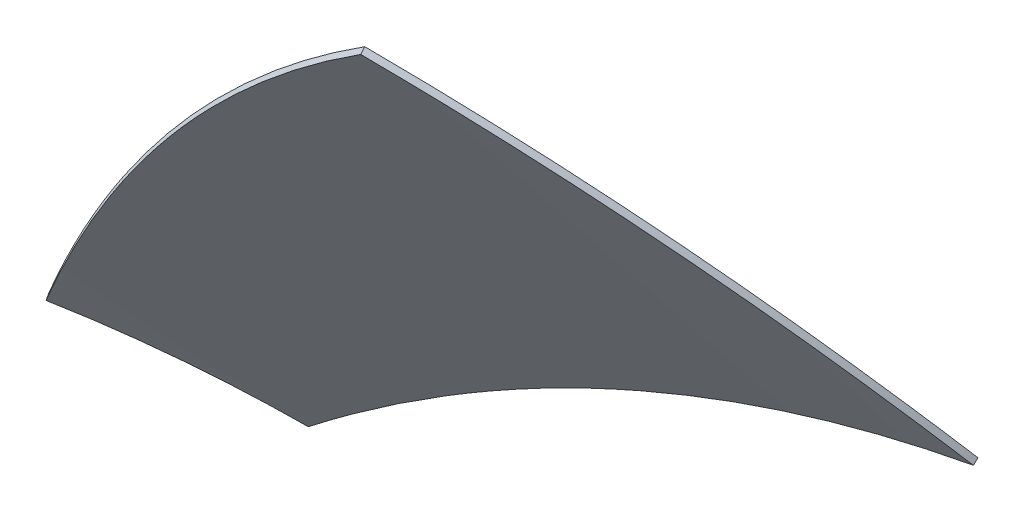
ISO-10303-21;
HEADER;
FILE_DESCRIPTION(('STEP AP214'),'2;1');
FILE_NAME('part.step','',(''),(''),'','','');
FILE_SCHEMA(('AUTOMOTIVE_DESIGN { 1 0 10303 214 1 1 1 1 }'));
ENDSEC;
DATA;
#1=APPLICATION_CONTEXT('core data for automotive mechanical design processes');
#2=APPLICATION_PROTOCOL_DEFINITION('international standard','automotive_design',2000,#1);
#3=PRODUCT_CONTEXT('',#1,'mechanical');
#4=PRODUCT('Part','Part','',(#3));
#5=PRODUCT_RELATED_PRODUCT_CATEGORY('part','',(#4));
#6=PRODUCT_DEFINITION_FORMATION('','',#4);
#7=PRODUCT_DEFINITION_CONTEXT('part definition',#1,'design');
#8=PRODUCT_DEFINITION('design','',#6,#7);
#9=PRODUCT_DEFINITION_SHAPE('','',#8);
#10=(LENGTH_UNIT() NAMED_UNIT(*) SI_UNIT(.MILLI.,.METRE.));
#11=(NAMED_UNIT(*) PLANE_ANGLE_UNIT() SI_UNIT($,.RADIAN.));
#12=(NAMED_UNIT(*) SI_UNIT($,.STERADIAN.) SOLID_ANGLE_UNIT());
#13=UNCERTAINTY_MEASURE_WITH_UNIT(LENGTH_MEASURE(1.E-05),#10,'distance_accuracy_value','');
#14=(GEOMETRIC_REPRESENTATION_CONTEXT(3) GLOBAL_UNCERTAINTY_ASSIGNED_CONTEXT((#13)) GLOBAL_UNIT_ASSIGNED_CONTEXT((#10,
#11,#12)) REPRESENTATION_CONTEXT('',''));
#15=CARTESIAN_POINT('',(0.,0.,0.));
#16=DIRECTION('',(0.,0.,1.));
#17=DIRECTION('',(1.,0.,0.));
#18=AXIS2_PLACEMENT_3D('',#15,#16,#17);
#19=CARTESIAN_POINT('',(164.677765247662,-161.806983646193,-2.70380006520967));
#20=DIRECTION('',(0.,0.,1.));
#21=DIRECTION('',(1.,0.,0.));
#22=AXIS2_PLACEMENT_3D('',#19,#20,#21);
#23=CONICAL_SURFACE('',#22,60.5897364806194,0.959931088596881);
#24=CARTESIAN_POINT('',(145.713494932421,-104.341377596432,-2.75685890943702));
#25=CARTESIAN_POINT('',(145.607225304668,-104.419446481523,-2.78545031196069));
#26=CARTESIAN_POINT('',(145.501244422635,-104.497895044637,-2.8140846506439));
#27=CARTESIAN_POINT('',(144.972755874823,-104.892052040336,-2.95747719661464));
#28=CARTESIAN_POINT('',(144.554615530205,-105.213415494873,-3.07286583752212));
#29=CARTESIAN_POINT('',(143.727953120132,-105.867853595363,-3.30487066357202));
#30=CARTESIAN_POINT('',(143.31943104411,-106.20092822845,-3.42148684736563));
#31=CARTESIAN_POINT('',(142.714110182886,-106.709063155329,-3.59725752114053));
#32=CARTESIAN_POINT('',(142.51358758485,-106.879855454828,-3.65598661374874));
#33=CARTESIAN_POINT('',(141.915746184766,-107.396489727506,-3.8326012584793));
#34=CARTESIAN_POINT('',(141.52218385294,-107.746564552002,-3.95090559239463));
#35=CARTESIAN_POINT('',(140.939655452774,-108.279865787299,-4.12913543100646));
#36=CARTESIAN_POINT('',(140.746788794091,-108.458990951779,-4.18867206015954));
#37=CARTESIAN_POINT('',(140.172093821618,-109.000468226771,-4.36768046820569));
#38=CARTESIAN_POINT('',(139.794199623641,-109.366896224075,-4.48754201820771));
#39=CARTESIAN_POINT('',(139.235543374011,-109.924419359587,-4.66806686045669));
#40=CARTESIAN_POINT('',(139.05069546444,-110.111566881271,-4.72836165708129));
#41=CARTESIAN_POINT('',(138.500261015965,-110.676964014639,-4.90963440814225));
#42=CARTESIAN_POINT('',(138.138812025549,-111.059140788549,-5.03099176164526));
#43=CARTESIAN_POINT('',(137.427229102912,-111.833589290189,-5.27461244724082));
#44=CARTESIAN_POINT('',(137.077095157683,-112.225861006312,-5.39687577829156));
#45=CARTESIAN_POINT('',(136.388321177041,-113.020133390027,-5.64217967862846));
#46=CARTESIAN_POINT('',(136.049681128926,-113.422134046867,-5.76522024705555));
#47=CARTESIAN_POINT('',(135.384112636649,-114.235512897457,-6.01197339601547));
#48=CARTESIAN_POINT('',(135.057184184198,-114.646891084568,-6.13568597607261));
#49=CARTESIAN_POINT('',(134.415262489176,-115.478684941217,-6.38369025592495));
#50=CARTESIAN_POINT('',(134.100269242735,-115.899100607824,-6.50798195553236));
#51=CARTESIAN_POINT('',(133.482457724483,-116.748640172092,-6.7570677368484));
#52=CARTESIAN_POINT('',(133.179639453266,-117.177764070179,-6.88186181858158));
#53=CARTESIAN_POINT('',(132.586434476111,-118.044390766266,-7.1318864310882));
#54=CARTESIAN_POINT('',(132.296047775331,-118.481893567741,-7.25711696204267));
#55=CARTESIAN_POINT('',(131.548937939594,-119.643291396346,-7.58703758072571));
#56=CARTESIAN_POINT('',(131.102742654481,-120.373881957302,-7.79205754909997));
#57=CARTESIAN_POINT('',(130.674005773103,-121.114552276329,-7.99752302693661));
#58=B_SPLINE_CURVE_WITH_KNOTS('',3,(#24,#25,#26,#27,#28,#29,#30,#31,#32,#33,#34,#35,#36,#37,#38,
#39,#40,#41,#42,#43,#44,#45,#46,#47,#48,#49,#50,#51,#52,#53,#54,#55,#56,#57),.UNSPECIFIED.,.F.,
.F.,(4,2,2,2,2,2,2,2,2,2,2,2,2,2,2,2,4),(0.,0.404785746297728,2.02408047516249,3.64337342494574,
4.45295972721342,6.07225152820658,6.88183780485193,8.50113011852531,9.3107165672272,
10.9300105621245,12.5493026952509,14.1685930389361,15.7878822365273,17.4071709090637,
19.0264596606987,20.6457490840248,23.2857206570532),.UNSPECIFIED.);
#59=CARTESIAN_POINT('',(145.713494932421,-104.341377596432,-2.75685890943712));
#60=VERTEX_POINT('',#59);
#61=CARTESIAN_POINT('',(130.674005773102,-121.114552276329,-7.99752302693631));
#62=VERTEX_POINT('',#61);
#63=EDGE_CURVE('E24',#60,#62,#58,.T.);
#64=ORIENTED_EDGE('',*,*,#63,.T.);
#65=CARTESIAN_POINT('',(130.674005773103,-121.114552276329,-7.99752302693621));
#66=CARTESIAN_POINT('',(130.780010183614,-121.157870975191,-8.06839270908241));
#67=CARTESIAN_POINT('',(130.885360123607,-121.2023684865,-8.13954595753031));
#68=CARTESIAN_POINT('',(131.409063245566,-121.430747440456,-8.49686090490643));
#69=CARTESIAN_POINT('',(131.817336354725,-121.63192702956,-8.78704423252544));
#70=CARTESIAN_POINT('',(132.446402386398,-121.977620110933,-9.25266430868875));
#71=CARTESIAN_POINT('',(132.674939038419,-122.111187448792,-9.42595602925599));
#72=CARTESIAN_POINT('',(132.994798262464,-122.309460646346,-9.67445744911161));
#73=CARTESIAN_POINT('',(133.08955990236,-122.369669244377,-9.74885104371575));
#74=CARTESIAN_POINT('',(133.507478776553,-122.641736032716,-10.080402685016));
#75=CARTESIAN_POINT('',(133.82231820474,-122.864292471453,-10.3394946224091));
#76=CARTESIAN_POINT('',(134.215785846258,-123.165510374972,-10.6757424971135));
#77=CARTESIAN_POINT('',(134.30345206687,-123.234178082967,-10.7514987942411));
#78=CARTESIAN_POINT('',(134.683428646579,-123.53868893267,-11.0835807574494));
#79=CARTESIAN_POINT('',(134.966973776721,-123.784017605835,-11.3411894895936));
#80=CARTESIAN_POINT('',(135.240458471532,-124.039479469806,-11.5999996128498));
#81=B_SPLINE_CURVE_WITH_KNOTS('',3,(#65,#66,#67,#68,#69,#70,#71,#72,#73,#74,#75,#76,#77,#78,#79,
#80),.UNSPECIFIED.,.F.,.F.,(4,2,2,2,2,2,2,4),(0.,0.404039967202498,2.02138933713873,
2.97026784667526,3.37430460638565,4.76665393129996,5.1706901907467,6.53488990231765),.UNSPECIFIED.);
#82=CARTESIAN_POINT('',(135.24045847322,-124.039479471383,-11.5999996144474));
#83=VERTEX_POINT('',#82);
#84=EDGE_CURVE('E119',#62,#83,#81,.T.);
#85=ORIENTED_EDGE('',*,*,#84,.T.);
#86=CARTESIAN_POINT('',(135.24045847435,-124.039479473395,-11.5999996160448));
#87=CARTESIAN_POINT('',(135.347951970338,-123.955695174218,-11.5999996494659));
#88=CARTESIAN_POINT('',(135.455809618855,-123.872374182624,-11.6000047399862));
#89=CARTESIAN_POINT('',(135.996954251853,-123.458053693674,-11.6000530761268));
#90=CARTESIAN_POINT('',(136.435631000727,-123.134048270053,-11.6001649766075));
#91=CARTESIAN_POINT('',(137.323849057909,-122.501320053386,-11.6004735845139));
#92=CARTESIAN_POINT('',(137.773390351892,-122.19259724019,-11.6006702918279));
#93=CARTESIAN_POINT('',(138.682783088813,-121.590722474117,-11.6010958966164));
#94=CARTESIAN_POINT('',(139.142634520299,-121.297570503943,-11.6013247940552));
#95=CARTESIAN_POINT('',(140.072068462629,-120.727133342786,-11.6017712994769));
#96=CARTESIAN_POINT('',(140.54165096477,-120.449848137612,-11.6019889074699));
#97=CARTESIAN_POINT('',(141.489994589073,-119.911416324192,-11.6023789968145));
#98=CARTESIAN_POINT('',(141.968755705072,-119.650269705108,-11.6025514781963));
#99=CARTESIAN_POINT('',(142.693282644822,-119.270894579536,-11.6027589088298));
#100=CARTESIAN_POINT('',(142.935842483944,-119.146500094628,-11.602819501902));
#101=CARTESIAN_POINT('',(143.666708732576,-118.779486132016,-11.6029726866694));
#102=CARTESIAN_POINT('',(144.15815012175,-118.543064373516,-11.6030366646345));
#103=CARTESIAN_POINT('',(145.148756515376,-118.087042209601,-11.6030799623007));
#104=CARTESIAN_POINT('',(145.647921519069,-117.867441802531,-11.6030592820101));
#105=CARTESIAN_POINT('',(146.65343487504,-117.445303998216,-11.6029358242943));
#106=CARTESIAN_POINT('',(147.159783228276,-117.242766603247,-11.6028330468581));
#107=CARTESIAN_POINT('',(147.924181712739,-116.951975311196,-11.6026274061319));
#108=CARTESIAN_POINT('',(148.179779921985,-116.857218783119,-11.6025502856862));
#109=CARTESIAN_POINT('',(148.949010973358,-116.579461891372,-11.6022970817963));
#110=CARTESIAN_POINT('',(149.465025184736,-116.402996242566,-11.6020991678217));
#111=CARTESIAN_POINT('',(150.502751598229,-116.06775734335,-11.6016733387467));
#112=CARTESIAN_POINT('',(151.024463804364,-115.908984105426,-11.6014454236252));
#113=CARTESIAN_POINT('',(152.07302693343,-115.609357256864,-11.6009981951362));
#114=CARTESIAN_POINT('',(152.599877861127,-115.468503662852,-11.6007788817767));
#115=CARTESIAN_POINT('',(153.39348237769,-115.27085486069,-11.6004924206027));
#116=CARTESIAN_POINT('',(153.658557284031,-115.207246970985,-11.600404022036));
#117=CARTESIAN_POINT('',(154.596221500762,-114.990749045836,-11.6001296377105));
#118=CARTESIAN_POINT('',(155.271665503102,-114.850190578458,-11.6000013307996));
#119=CARTESIAN_POINT('',(155.949990445605,-114.72444602859,-11.5999996160448));
#120=B_SPLINE_CURVE_WITH_KNOTS('',3,(#86,#87,#88,#89,#90,#91,#92,#93,#94,#95,#96,#97,#98,#99,
#100,#101,#102,#103,#104,#105,#106,#107,#108,#109,#110,#111,#112,#113,#114,#115,#116,#117,#118,
#119),.UNSPECIFIED.,.F.,.F.,(4,2,2,2,2,2,2,2,2,2,2,2,2,2,2,2,4),(0.,0.408872021062319,
2.04458807223249,3.68030196669168,5.31601404417217,6.95172465868246,8.58743417477637,
9.40520007880727,11.0409086462069,12.6766170528684,14.3123256776974,15.1300916080284,
16.7658012669123,18.4015120800397,20.0372244105804,20.8549909367445,22.9242005441218),.UNSPECIFIED.);
#121=CARTESIAN_POINT('',(155.949990457788,-114.724446015506,-11.5999996085914));
#122=VERTEX_POINT('',#121);
#123=EDGE_CURVE('E69',#83,#122,#120,.T.);
#124=ORIENTED_EDGE('',*,*,#123,.T.);
#125=CARTESIAN_POINT('',(155.949990469971,-114.724446002421,-11.5999996011381));
#126=CARTESIAN_POINT('',(155.887990162428,-114.629803978791,-11.5269277910737));
#127=CARTESIAN_POINT('',(155.825545250114,-114.535400439451,-11.4539216141485));
#128=CARTESIAN_POINT('',(155.636850501834,-114.252915275906,-11.2350973072199));
#129=CARTESIAN_POINT('',(155.509250206676,-114.065573981897,-11.0894848477296));
#130=CARTESIAN_POINT('',(155.315074537723,-113.786128616506,-10.8715023186324));
#131=CARTESIAN_POINT('',(155.249882159292,-113.693234868922,-10.7989091493191));
#132=CARTESIAN_POINT('',(155.118568102341,-113.507984379142,-10.6538734847002));
#133=CARTESIAN_POINT('',(155.05244640659,-113.415627646949,-10.581430992217));
#134=CARTESIAN_POINT('',(154.852330554802,-113.138949930964,-10.363990384886));
#135=CARTESIAN_POINT('',(154.716900688701,-112.955475306612,-10.2192331020793));
#136=CARTESIAN_POINT('',(154.442390768827,-112.590771940971,-9.93034264762662));
#137=CARTESIAN_POINT('',(154.303310603305,-112.409543268688,-9.78620949524514));
#138=CARTESIAN_POINT('',(154.021855067595,-112.049189587161,-9.49848854379869));
#139=CARTESIAN_POINT('',(153.879479418234,-111.870064758092,-9.35490079214506));
#140=CARTESIAN_POINT('',(153.591235115598,-111.514135004343,-9.06835790941786));
#141=CARTESIAN_POINT('',(153.44536648462,-111.337330064866,-8.92540277431321));
#142=CARTESIAN_POINT('',(153.15001606895,-110.986203591204,-8.6401833685079));
#143=CARTESIAN_POINT('',(153.000534354696,-110.811882008712,-8.49791908440389));
#144=CARTESIAN_POINT('',(152.697917108614,-110.465839457632,-8.21411813857969));
#145=CARTESIAN_POINT('',(152.54478154673,-110.294118510458,-8.07258148285695));
#146=CARTESIAN_POINT('',(152.080027214191,-109.782971576924,-7.64910567342873));
#147=CARTESIAN_POINT('',(151.763017291441,-109.447509764941,-7.36825867805563));
#148=CARTESIAN_POINT('',(151.277722235689,-108.952879214092,-6.94955050669778));
#149=CARTESIAN_POINT('',(151.114529627578,-108.789620915469,-6.81057404082087));
#150=CARTESIAN_POINT('',(150.78484273402,-108.465869602596,-6.53337507257238));
#151=CARTESIAN_POINT('',(150.618348828011,-108.305376274469,-6.39515248585514));
#152=CARTESIAN_POINT('',(150.113964304522,-107.828075414162,-5.98159218949962));
#153=CARTESIAN_POINT('',(149.771178419024,-107.5154546872,-5.70736844271489));
#154=CARTESIAN_POINT('',(149.072921569564,-106.901885292023,-5.16201748177781));
#155=CARTESIAN_POINT('',(148.717450576427,-106.600936650657,-4.89089027474917));
#156=CARTESIAN_POINT('',(148.174940808852,-106.158766035365,-4.48668164262353));
#157=CARTESIAN_POINT('',(147.992562940675,-106.012924885354,-4.35236572223026));
#158=CARTESIAN_POINT('',(147.470067483613,-105.603105109157,-3.97199688775233));
#159=CARTESIAN_POINT('',(147.126247178738,-105.342892808342,-3.72694466704815));
#160=CARTESIAN_POINT('',(146.427846477052,-104.833565478698,-3.2396629766787));
#161=CARTESIAN_POINT('',(146.073255714196,-104.584461749436,-2.99743655830583));
#162=CARTESIAN_POINT('',(145.713494932421,-104.341377596433,-2.75685890943715));
#163=B_SPLINE_CURVE_WITH_KNOTS('',3,(#125,#126,#127,#128,#129,#130,#131,#132,#133,#134,#135,
#136,#137,#138,#139,#140,#141,#142,#143,#144,#145,#146,#147,#148,#149,#150,#151,#152,#153,#154,
#155,#156,#157,#158,#159,#160,#161,#162),.UNSPECIFIED.,.F.,.F.,(4,2,2,2,2,2,2,2,2,2,2,2,2,2,2,2,
2,2,4),(0.,0.40406407420745,1.21225539803086,1.6164071244678,2.02056635469793,2.83085306958814,
3.64116461902188,4.45154506620358,5.26192034214463,6.07227983251894,6.88264599159149,
8.50313968458857,9.31144155114741,10.1196510475197,11.7361077374934,13.3525681454349,
14.1607182651822,15.6483272818095,17.1374164906629),.UNSPECIFIED.);
#164=EDGE_CURVE('E66',#122,#60,#163,.T.);
#165=ORIENTED_EDGE('',*,*,#164,.T.);
#166=EDGE_LOOP('',(#64,#85,#124,#165));
#167=FACE_BOUND('',#166,.T.);
#168=ADVANCED_FACE('F17',(#167),#23,.F.);
#169=CARTESIAN_POINT('',(130.59971208158,-121.025644726392,-8.16299173988277));
#170=CARTESIAN_POINT('',(130.599957275281,-121.02593815065,-8.16244563851991));
#171=CARTESIAN_POINT('',(130.600202468983,-121.026231574907,-8.16189953715705));
#172=CARTESIAN_POINT('',(130.600447662684,-121.026524999164,-8.16135343579419));
#173=CARTESIAN_POINT('',(130.624967032824,-121.055867424886,-8.10674329950826));
#174=CARTESIAN_POINT('',(130.649486402963,-121.085209850608,-8.05213316322233));
#175=CARTESIAN_POINT('',(130.674005773103,-121.114552276329,-7.99752302693641));
#176=CARTESIAN_POINT('',(132.766184593014,-117.288830760427,-7.12789737510282));
#177=CARTESIAN_POINT('',(132.766407367252,-117.289142924679,-7.12735127373996));
#178=CARTESIAN_POINT('',(132.766630141491,-117.289455088931,-7.1268051723771));
#179=CARTESIAN_POINT('',(132.76685291573,-117.289767253183,-7.12625907101424));
#180=CARTESIAN_POINT('',(132.789130339606,-117.320983678376,-7.07164893472832));
#181=CARTESIAN_POINT('',(132.811411171902,-117.352195560236,-7.01703879844239));
#182=CARTESIAN_POINT('',(132.833688595779,-117.38341198543,-6.96242866215647));
#183=CARTESIAN_POINT('',(137.372285046869,-111.141326369228,-5.31571778038501));
#184=CARTESIAN_POINT('',(137.372466129202,-111.141665700915,-5.31517167902215));
#185=CARTESIAN_POINT('',(137.372647211535,-111.142005032601,-5.31462557765929));
#186=CARTESIAN_POINT('',(137.372828293868,-111.142344364288,-5.31407947629643));
#187=CARTESIAN_POINT('',(137.390936527182,-111.176277532943,-5.2594693400105));
#188=CARTESIAN_POINT('',(137.40904318463,-111.2102124,-5.20485920372458));
#189=CARTESIAN_POINT('',(137.427151417944,-111.244145568655,-5.15024906743865));
#190=CARTESIAN_POINT('',(143.092460012499,-106.127927310826,-3.61624611019745));
#191=CARTESIAN_POINT('',(143.092598104836,-106.128284408425,-3.61570000883459));
#192=CARTESIAN_POINT('',(143.092736197174,-106.128641506025,-3.61515390747173));
#193=CARTESIAN_POINT('',(143.092874289511,-106.128998603624,-3.61460780610887));
#194=CARTESIAN_POINT('',(143.106683523238,-106.164708363554,-3.55999766982294));
#195=CARTESIAN_POINT('',(143.120493377965,-106.200417592462,-3.50538753353702));
#196=CARTESIAN_POINT('',(143.134302611692,-106.236127352392,-3.4507773972511));
#197=CARTESIAN_POINT('',(145.677185184843,-104.23135165737,-2.92232762238331));
#198=CARTESIAN_POINT('',(145.677305018993,-104.231714779281,-2.92178152102045));
#199=CARTESIAN_POINT('',(145.677424853144,-104.232077901192,-2.92123541965759));
#200=CARTESIAN_POINT('',(145.677544687294,-104.232441023103,-2.92068931829473));
#201=CARTESIAN_POINT('',(145.689528102336,-104.268753214212,-2.86607918200881));
#202=CARTESIAN_POINT('',(145.701511517379,-104.305065405322,-2.81146904572289));
#203=CARTESIAN_POINT('',(145.713494932421,-104.341377596432,-2.75685890943696));
#204=B_SPLINE_SURFACE_WITH_KNOTS('',3,3,((#169,#170,#171,#172,#173,#174,#175),(#176,#177,#178,
#179,#180,#181,#182),(#183,#184,#185,#186,#187,#188,#189),(#190,#191,#192,#193,#194,#195,#196),
(#197,#198,#199,#200,#201,#202,#203)),.UNSPECIFIED.,.F.,.F.,.F.,(4,1,4),(4,3,4),(0.,
0.571428571428571,1.),(-0.01,0.,1.),.UNSPECIFIED.);
#205=DIRECTION('',(0.367790552085545,-0.440136385830606,0.819152044290059));
#206=VECTOR('',#205,1.);
#207=CARTESIAN_POINT('',(130.637594508445,-121.070978774133,-8.078619079321));
#208=LINE('',#207,#206);
#209=CARTESIAN_POINT('',(130.602153990644,-121.028566038,-8.15755361789338));
#210=VERTEX_POINT('',#209);
#211=EDGE_CURVE('E78',#210,#62,#208,.T.);
#212=DIRECTION('',(-0.179751225644478,0.54468286664893,-0.819152044286292));
#213=VECTOR('',#212,1.);
#214=CARTESIAN_POINT('',(145.695519809858,-104.286909309768,-2.83877411386609));
#215=LINE('',#214,#213);
#216=CARTESIAN_POINT('',(145.677544679896,-104.232441018115,-2.920689313355));
#217=VERTEX_POINT('',#216);
#218=EDGE_CURVE('E73',#60,#217,#215,.T.);
#219=CARTESIAN_POINT('',(130.602154309022,-121.028565488528,-8.15755346593886));
#220=CARTESIAN_POINT('',(130.667291071637,-120.916149257558,-8.12646529209306));
#221=CARTESIAN_POINT('',(130.732831785229,-120.803962632582,-8.09538661822159));
#222=CARTESIAN_POINT('',(131.062566618538,-120.244150955685,-7.94003108596973));
#223=CARTESIAN_POINT('',(131.332784406926,-119.800011942344,-7.81590135323699));
#224=CARTESIAN_POINT('',(131.885756329915,-118.919523493207,-7.5679951217375));
#225=CARTESIAN_POINT('',(132.168510451887,-118.483174049566,-7.44421862261509));
#226=CARTESIAN_POINT('',(132.746295014612,-117.618557577306,-7.19705590746242));
#227=CARTESIAN_POINT('',(133.041325447224,-117.190290543327,-7.07366969117341));
#228=CARTESIAN_POINT('',(133.643390138888,-116.342175210068,-6.82735111494786));
#229=CARTESIAN_POINT('',(133.950424394131,-115.922326908115,-6.70441875486726));
#230=CARTESIAN_POINT('',(134.889443859982,-114.67552764199,-6.33629581070549));
#231=CARTESIAN_POINT('',(135.539181807598,-113.861567635682,-6.09184945921674));
#232=CARTESIAN_POINT('',(136.54758258947,-112.669073024062,-5.72735853166878));
#233=CARTESIAN_POINT('',(136.889297886726,-112.276369133034,-5.60624159440968));
#234=CARTESIAN_POINT('',(137.583891041514,-111.500660603854,-5.36480955245761));
#235=CARTESIAN_POINT('',(137.936768911781,-111.11765597677,-5.24449444867961));
#236=CARTESIAN_POINT('',(138.474267265353,-110.550754204577,-5.06473791114257));
#237=CARTESIAN_POINT('',(138.654790318543,-110.363061105244,-5.00494056133917));
#238=CARTESIAN_POINT('',(139.200447307387,-109.803775197502,-4.82589292425726));
#239=CARTESIAN_POINT('',(139.569643482998,-109.436003551456,-4.70699577194184));
#240=CARTESIAN_POINT('',(140.131233195018,-108.892252843443,-4.52939529239466));
#241=CARTESIAN_POINT('',(140.319722004103,-108.712326806532,-4.47032147747802));
#242=CARTESIAN_POINT('',(141.268924055796,-107.819023212408,-4.17546826775381));
#243=CARTESIAN_POINT('',(142.049105476678,-107.125413079379,-3.94149282109032));
#244=CARTESIAN_POINT('',(143.307584203198,-106.06887660321,-3.57668695429995));
#245=CARTESIAN_POINT('',(143.772962361959,-105.690907783258,-3.4443611306423));
#246=CARTESIAN_POINT('',(144.716069628765,-104.950176491461,-3.18130275981973));
#247=CARTESIAN_POINT('',(145.193798178683,-104.587413334393,-3.05057014104767));
#248=CARTESIAN_POINT('',(145.677544642661,-104.232441055853,-2.92068933027758));
#249=B_SPLINE_CURVE_WITH_KNOTS('',3,(#219,#220,#221,#222,#223,#224,#225,#226,#227,#228,#229,
#230,#231,#232,#233,#234,#235,#236,#237,#238,#239,#240,#241,#242,#243,#244,#245,#246,#247,#248),
.UNSPECIFIED.,.F.,.F.,(4,2,2,2,2,2,2,2,2,2,2,2,2,2,4),(0.,0.400777866563023,2.00403374908383,
3.60728801679554,5.2105412213189,6.81379391687488,10.0212079908915,11.6244625823051,
13.227719002867,14.0292894157384,15.6325464801447,16.4341166587209,19.6415529377432,
21.4831733930974,23.3247107686415),.UNSPECIFIED.);
#250=EDGE_CURVE('E113',#210,#217,#249,.T.);
#251=ORIENTED_EDGE('',*,*,#211,.T.);
#252=ORIENTED_EDGE('',*,*,#63,.F.);
#253=ORIENTED_EDGE('',*,*,#218,.T.);
#254=ORIENTED_EDGE('',*,*,#250,.F.);
#255=EDGE_LOOP('',(#251,#252,#253,#254));
#256=FACE_BOUND('',#255,.T.);
#257=ADVANCED_FACE('F75',(#256),#204,.F.);
#258=CARTESIAN_POINT('',(145.677185184843,-104.23135165737,-2.92232762238348));
#259=CARTESIAN_POINT('',(145.677305018993,-104.231714779281,-2.92178152102062));
#260=CARTESIAN_POINT('',(145.677424853144,-104.232077901192,-2.92123541965776));
#261=CARTESIAN_POINT('',(145.677544687294,-104.232441023103,-2.9206893182949));
#262=CARTESIAN_POINT('',(145.689528102337,-104.268753214213,-2.86607918200902));
#263=CARTESIAN_POINT('',(145.701511517379,-104.305065405323,-2.81146904572315));
#264=CARTESIAN_POINT('',(145.713494932421,-104.341377596433,-2.75685890943727));
#265=CARTESIAN_POINT('',(145.713615964913,-104.341744349563,-2.75630734706078));
#266=CARTESIAN_POINT('',(145.713736997405,-104.342111102693,-2.7557557846843));
#267=CARTESIAN_POINT('',(145.713858029897,-104.342477855824,-2.75520422230781));
#268=CARTESIAN_POINT('',(148.12815000735,-105.883963422378,-4.55903629348517));
#269=CARTESIAN_POINT('',(148.12825899896,-105.884330128189,-4.55849019212231));
#270=CARTESIAN_POINT('',(148.128367990569,-105.884696834,-4.55794409075945));
#271=CARTESIAN_POINT('',(148.128476982179,-105.885063539811,-4.55739798939659));
#272=CARTESIAN_POINT('',(148.139376143152,-105.921734120927,-4.5027878531107));
#273=CARTESIAN_POINT('',(148.150276683065,-105.958402523601,-4.44817771682481));
#274=CARTESIAN_POINT('',(148.161175844038,-105.995073104717,-4.39356758053892));
#275=CARTESIAN_POINT('',(148.161285925564,-105.995443477586,-4.39301601816243));
#276=CARTESIAN_POINT('',(148.16139600709,-105.995813850456,-4.39246445578595));
#277=CARTESIAN_POINT('',(148.161506088616,-105.996184223325,-4.39191289340946));
#278=CARTESIAN_POINT('',(151.146443040385,-108.527599681069,-6.90067911727312));
#279=CARTESIAN_POINT('',(151.146537795469,-108.527970316516,-6.90013301591026));
#280=CARTESIAN_POINT('',(151.146632550554,-108.528340951962,-6.8995869145474));
#281=CARTESIAN_POINT('',(151.146727305638,-108.528711587409,-6.89904081318454));
#282=CARTESIAN_POINT('',(151.156202814067,-108.565775132072,-6.84443067689863));
#283=CARTESIAN_POINT('',(151.165679782465,-108.602838293507,-6.78982054061274));
#284=CARTESIAN_POINT('',(151.175155290894,-108.63990183817,-6.73521040432683));
#285=CARTESIAN_POINT('',(151.175250993529,-108.640276179971,-6.73465884195034));
#286=CARTESIAN_POINT('',(151.175346696164,-108.640650521772,-6.73410727957385));
#287=CARTESIAN_POINT('',(151.175442398799,-108.641024863573,-6.73355571719737));
#288=CARTESIAN_POINT('',(153.707518984334,-111.544964215479,-9.3552159876131));
#289=CARTESIAN_POINT('',(153.707600614936,-111.545337804354,-9.35466988625024));
#290=CARTESIAN_POINT('',(153.707682245539,-111.545711393229,-9.35412378488738));
#291=CARTESIAN_POINT('',(153.707763876141,-111.546084982104,-9.35357768352452));
#292=CARTESIAN_POINT('',(153.71592693639,-111.583443869596,-9.29896754723861));
#293=CARTESIAN_POINT('',(153.724087211208,-111.620803552951,-9.24435741095269));
#294=CARTESIAN_POINT('',(153.732250271457,-111.658162440443,-9.18974727466678));
#295=CARTESIAN_POINT('',(153.732332718366,-111.658539765207,-9.18919571229029));
#296=CARTESIAN_POINT('',(153.732415165274,-111.65891708997,-9.18864414991381));
#297=CARTESIAN_POINT('',(153.732497612183,-111.659294414734,-9.18809258753732));
#298=CARTESIAN_POINT('',(154.957438505298,-113.182134679978,-10.6558010423907));
#299=CARTESIAN_POINT('',(154.957513506599,-113.182509650673,-10.6552549410278));
#300=CARTESIAN_POINT('',(154.957588507901,-113.182884621367,-10.654708839665));
#301=CARTESIAN_POINT('',(154.957663509203,-113.183259592062,-10.6541627383021));
#302=CARTESIAN_POINT('',(154.965163639385,-113.220756661522,-10.5995526020162));
#303=CARTESIAN_POINT('',(154.972666815571,-113.258252695849,-10.5449424657303));
#304=CARTESIAN_POINT('',(154.980166945753,-113.295749765309,-10.4903323294444));
#305=CARTESIAN_POINT('',(154.980242697068,-113.296128485711,-10.4897807670679));
#306=CARTESIAN_POINT('',(154.980318448383,-113.296507206112,-10.4892292046914));
#307=CARTESIAN_POINT('',(154.980394199698,-113.296885926514,-10.4886776423149));
#308=CARTESIAN_POINT('',(155.547809419442,-114.029935877927,-11.3171126533402));
#309=CARTESIAN_POINT('',(155.547881237345,-114.030311461728,-11.3165665519773));
#310=CARTESIAN_POINT('',(155.547953055247,-114.030687045528,-11.3160204506145));
#311=CARTESIAN_POINT('',(155.54802487315,-114.031062629328,-11.3154743492516));
#312=CARTESIAN_POINT('',(155.55520666342,-114.068621009347,-11.2608642129657));
#313=CARTESIAN_POINT('',(155.562383629988,-114.106180843232,-11.2062540766797));
#314=CARTESIAN_POINT('',(155.569565420259,-114.143739223252,-11.1516439403938));
#315=CARTESIAN_POINT('',(155.569637956341,-114.14411856289,-11.1510923780173));
#316=CARTESIAN_POINT('',(155.569710492422,-114.144497902528,-11.1505408156408));
#317=CARTESIAN_POINT('',(155.569783028504,-114.144877242167,-11.1499892532643));
#318=CARTESIAN_POINT('',(155.928872605484,-114.610524351871,-11.7654683091632));
#319=CARTESIAN_POINT('',(155.928942301393,-114.610900330895,-11.7649222078003));
#320=CARTESIAN_POINT('',(155.929011997301,-114.611276309918,-11.7643761064375));
#321=CARTESIAN_POINT('',(155.92908169321,-114.611652288942,-11.7638300050746));
#322=CARTESIAN_POINT('',(155.936051284072,-114.649250191311,-11.7092198687886));
#323=CARTESIAN_POINT('',(155.943020874933,-114.686848093679,-11.6546097325027));
#324=CARTESIAN_POINT('',(155.949990465795,-114.724445996047,-11.5999995962168));
#325=CARTESIAN_POINT('',(155.950060858663,-114.724825734861,-11.5994480338403));
#326=CARTESIAN_POINT('',(155.95013125153,-114.725205473675,-11.5988964714638));
#327=CARTESIAN_POINT('',(155.950201644398,-114.725585212489,-11.5983449090873));
#328=B_SPLINE_SURFACE_WITH_KNOTS('',3,3,((#258,#259,#260,#261,#262,#263,#264,#265,#266,#267),
(#268,#269,#270,#271,#272,#273,#274,#275,#276,#277),(#278,#279,#280,#281,#282,#283,#284,#285,
#286,#287),(#288,#289,#290,#291,#292,#293,#294,#295,#296,#297),(#298,#299,#300,#301,#302,#303,
#304,#305,#306,#307),(#308,#309,#310,#311,#312,#313,#314,#315,#316,#317),(#318,#319,#320,#321,
#322,#323,#324,#325,#326,#327)),.UNSPECIFIED.,.F.,.F.,.F.,(4,1,1,1,4),(4,3,3,4),(0.,
0.571428571428571,0.785714285714286,0.857142857142857,1.),(-0.01,0.,1.,1.0101),.UNSPECIFIED.);
#329=DIRECTION('',(-0.104543863222306,0.563968535471727,-0.819152044287525));
#330=VECTOR('',#329,1.);
#331=CARTESIAN_POINT('',(155.939349254838,-114.667041581855,-11.6833783342162));
#332=LINE('',#331,#330);
#333=CARTESIAN_POINT('',(155.929144759255,-114.611993112731,-11.7633350556309));
#334=VERTEX_POINT('',#333);
#335=EDGE_CURVE('E84',#122,#334,#332,.T.);
#336=CARTESIAN_POINT('',(145.677544672499,-104.232441013127,-2.92068930841496));
#337=CARTESIAN_POINT('',(145.77427365306,-104.297664422089,-2.98528436381657));
#338=CARTESIAN_POINT('',(145.870630203439,-104.363324904557,-3.04999988997035));
#339=CARTESIAN_POINT('',(146.350599670279,-104.69381387799,-3.37420303524113));
#340=CARTESIAN_POINT('',(146.72861108471,-104.965093802191,-3.63545965587698));
#341=CARTESIAN_POINT('',(147.473555062967,-105.521242030858,-4.16211375321942));
#342=CARTESIAN_POINT('',(147.840455635731,-105.806144418591,-4.42752036378367));
#343=CARTESIAN_POINT('',(148.562047136839,-106.38816916488,-4.96160069117481));
#344=CARTESIAN_POINT('',(148.916737087757,-106.685292497529,-5.23027466722629));
#345=CARTESIAN_POINT('',(149.613648256073,-107.291112324286,-5.77068658353253));
#346=CARTESIAN_POINT('',(149.95586981478,-107.59980850113,-6.0424244396498));
#347=CARTESIAN_POINT('',(150.627507323354,-108.228263442224,-6.5888355597878));
#348=CARTESIAN_POINT('',(150.956924536726,-108.548021109035,-6.86350853075039));
#349=CARTESIAN_POINT('',(151.440654160363,-109.035226673059,-7.27729815496643));
#350=CARTESIAN_POINT('',(151.599954929973,-109.198662515211,-7.41533568025707));
#351=CARTESIAN_POINT('',(151.915205122566,-109.528179182041,-7.69214453987859));
#352=CARTESIAN_POINT('',(152.071154151643,-109.694260313652,-7.83091595809679));
#353=CARTESIAN_POINT('',(152.37958954436,-110.029027056399,-8.10918199392755));
#354=CARTESIAN_POINT('',(152.53207577899,-110.19771276418,-8.24867663824788));
#355=CARTESIAN_POINT('',(152.833491480595,-110.537644220278,-8.52837994138193));
#356=CARTESIAN_POINT('',(152.982421001891,-110.708889929432,-8.66858858925112));
#357=CARTESIAN_POINT('',(153.276736818992,-111.053842977407,-8.94969089834595));
#358=CARTESIAN_POINT('',(153.422123135553,-111.2275503018,-9.09058455555319));
#359=CARTESIAN_POINT('',(153.709426508055,-111.577288819267,-9.37300884717277));
#360=CARTESIAN_POINT('',(153.851343644477,-111.753319958286,-9.51453946671804));
#361=CARTESIAN_POINT('',(154.131940642533,-112.107497747938,-9.79816121529219));
#362=CARTESIAN_POINT('',(154.270620497757,-112.285644402759,-9.94025234543057));
#363=CARTESIAN_POINT('',(154.54119849126,-112.639616531014,-10.2214780800882));
#364=CARTESIAN_POINT('',(154.673179519974,-112.815389840594,-10.3605985130674));
#365=CARTESIAN_POINT('',(154.933595706236,-113.169066797235,-10.6394471468995));
#366=CARTESIAN_POINT('',(155.062030885639,-113.346970431155,-10.779175344));
#367=CARTESIAN_POINT('',(155.315559414508,-113.704955668287,-11.0593322607726));
#368=CARTESIAN_POINT('',(155.440649454728,-113.885039189547,-11.1997615220883));
#369=CARTESIAN_POINT('',(155.687430171958,-114.247113209539,-11.4811556736832));
#370=CARTESIAN_POINT('',(155.809120795252,-114.429103738342,-11.6221205723865));
#371=CARTESIAN_POINT('',(155.929144791534,-114.611992955111,-11.763334951219));
#372=B_SPLINE_CURVE_WITH_KNOTS('',3,(#336,#337,#338,#339,#340,#341,#342,#343,#344,#345,#346,
#347,#348,#349,#350,#351,#352,#353,#354,#355,#356,#357,#358,#359,#360,#361,#362,#363,#364,#365,
#366,#367,#368,#369,#370,#371),.UNSPECIFIED.,.F.,.F.,(4,2,2,2,2,2,2,2,2,2,2,2,2,2,2,2,2,4),(0.,
0.400064411931948,2.00054433897383,3.60526278797079,5.21010939283643,6.81491203368372,
8.41955591209664,9.21970313772518,10.0199438907599,10.8202144091412,11.6204726973687,
12.4207262967807,13.2209613136794,14.0211979153725,14.8015687843933,15.5819348422282,
16.3630462937289,17.1441700811054),.UNSPECIFIED.);
#373=EDGE_CURVE('E81',#217,#334,#372,.T.);
#374=ORIENTED_EDGE('',*,*,#218,.F.);
#375=ORIENTED_EDGE('',*,*,#164,.F.);
#376=ORIENTED_EDGE('',*,*,#335,.T.);
#377=ORIENTED_EDGE('',*,*,#373,.F.);
#378=EDGE_LOOP('',(#374,#375,#376,#377));
#379=FACE_BOUND('',#378,.T.);
#380=ADVANCED_FACE('F79',(#379),#328,.F.);
#381=CARTESIAN_POINT('',(155.928708137321,-114.609637394969,-11.7667566684324));
#382=CARTESIAN_POINT('',(155.928832624785,-114.610308950528,-11.7657812485742));
#383=CARTESIAN_POINT('',(155.928957112248,-114.610980506087,-11.764805828716));
#384=CARTESIAN_POINT('',(155.929081599712,-114.611652061646,-11.7638304088578));
#385=CARTESIAN_POINT('',(155.936051190593,-114.649249964011,-11.7092202725719));
#386=CARTESIAN_POINT('',(155.943020781473,-114.686847866376,-11.6546101362859));
#387=CARTESIAN_POINT('',(155.949990372354,-114.72444576874,-11.6));
#388=CARTESIAN_POINT('',(155.950061313137,-114.724828463319,-11.5994441444386));
#389=CARTESIAN_POINT('',(155.950132253921,-114.725211157898,-11.5988882888771));
#390=CARTESIAN_POINT('',(155.950203194704,-114.725593852478,-11.5983324333157));
#391=CARTESIAN_POINT('',(148.396270393716,-116.005938628132,-11.7667566684324));
#392=CARTESIAN_POINT('',(148.396502098132,-116.006590416228,-11.7657812485742));
#393=CARTESIAN_POINT('',(148.396733802549,-116.007242204323,-11.764805828716));
#394=CARTESIAN_POINT('',(148.396965506966,-116.007893992419,-11.7638304088578));
#395=CARTESIAN_POINT('',(148.409937776983,-116.044385187916,-11.7092202725719));
#396=CARTESIAN_POINT('',(148.422903266681,-116.080859578565,-11.6546101362859));
#397=CARTESIAN_POINT('',(148.435875536699,-116.117350774063,-11.6));
#398=CARTESIAN_POINT('',(148.436007576443,-116.117722203899,-11.5994441444386));
#399=CARTESIAN_POINT('',(148.436139616188,-116.118093633735,-11.5988882888771));
#400=CARTESIAN_POINT('',(148.436271655932,-116.118465063571,-11.5983324333157));
#401=CARTESIAN_POINT('',(141.210861084292,-119.23789617168,-11.7667566684324));
#402=CARTESIAN_POINT('',(141.21119503525,-119.238501969844,-11.7657812485742));
#403=CARTESIAN_POINT('',(141.211528986208,-119.239107768009,-11.764805828716));
#404=CARTESIAN_POINT('',(141.211862937166,-119.239713566173,-11.7638304088578));
#405=CARTESIAN_POINT('',(141.230559611408,-119.273629956172,-11.7092202725719));
#406=CARTESIAN_POINT('',(141.249248210481,-119.307530123738,-11.6546101362859));
#407=CARTESIAN_POINT('',(141.267944884723,-119.341446513736,-11.6));
#408=CARTESIAN_POINT('',(141.268135190975,-119.341791735618,-11.5994441444386));
#409=CARTESIAN_POINT('',(141.268325497227,-119.342136957499,-11.5988882888771));
#410=CARTESIAN_POINT('',(141.268515803479,-119.342482179381,-11.5983324333157));
#411=CARTESIAN_POINT('',(135.168676933434,-123.947385122951,-11.7667566684324));
#412=CARTESIAN_POINT('',(135.169096808572,-123.947923814761,-11.7657812485742));
#413=CARTESIAN_POINT('',(135.169516683711,-123.94846250657,-11.764805828716));
#414=CARTESIAN_POINT('',(135.169936558849,-123.949001198379,-11.7638304088578));
#415=CARTESIAN_POINT('',(135.193443808924,-123.979160552703,-11.7092202725719));
#416=CARTESIAN_POINT('',(135.216951058999,-124.009319907026,-11.6546101362859));
#417=CARTESIAN_POINT('',(135.240458309074,-124.039479261349,-11.6));
#418=CARTESIAN_POINT('',(135.240697580326,-124.03978624181,-11.5994441444386));
#419=CARTESIAN_POINT('',(135.240936851578,-124.040093222272,-11.5988882888771));
#420=CARTESIAN_POINT('',(135.24117612283,-124.040400202733,-11.5983324333157));
#421=B_SPLINE_SURFACE_WITH_KNOTS('',3,3,((#381,#382,#383,#384,#385,#386,#387,#388,#389,#390),
(#391,#392,#393,#394,#395,#396,#397,#398,#399,#400),(#401,#402,#403,#404,#405,#406,#407,#408,
#409,#410),(#411,#412,#413,#414,#415,#416,#417,#418,#419,#420)),.UNSPECIFIED.,.F.,.F.,.F.,(4,4),
(4,3,3,4),(0.,1.),(-0.0178615166440583,0.,1.,1.01017861516644),.UNSPECIFIED.);
#422=DIRECTION('',(-0.352608751125393,0.452390314845452,-0.819152044289595));
#423=VECTOR('',#422,1.);
#424=CARTESIAN_POINT('',(135.205550205246,-123.994692828705,-11.6810956653055));
#425=LINE('',#424,#423);
#426=CARTESIAN_POINT('',(135.171293849748,-123.95074256091,-11.7606773996099));
#427=VERTEX_POINT('',#426);
#428=EDGE_CURVE('E45',#83,#427,#425,.T.);
#429=CARTESIAN_POINT('',(155.929144699595,-114.611993123783,-11.7633350556402));
#430=CARTESIAN_POINT('',(155.795136108721,-114.636819682417,-11.7633558068639));
#431=CARTESIAN_POINT('',(155.661232344425,-114.66222516445,-11.7633809560981));
#432=CARTESIAN_POINT('',(154.992190177645,-114.792152554481,-11.7635263085444));
#433=CARTESIAN_POINT('',(154.458705298542,-114.905333648252,-11.7637052995408));
#434=CARTESIAN_POINT('',(153.395952057166,-115.149935793019,-11.7641272290215));
#435=CARTESIAN_POINT('',(152.866683689372,-115.281356820129,-11.7643701674219));
#436=CARTESIAN_POINT('',(151.812945157211,-115.5622161403,-11.7648675373801));
#437=CARTESIAN_POINT('',(151.288474987547,-115.711654413471,-11.7651219689252));
#438=CARTESIAN_POINT('',(150.244936597194,-116.028312205034,-11.765598959705));
#439=CARTESIAN_POINT('',(149.725868371701,-116.195531707606,-11.765821518968));
#440=CARTESIAN_POINT('',(148.693702043117,-116.547519805173,-11.7662009936054));
#441=CARTESIAN_POINT('',(148.180603936035,-116.732288388429,-11.7663579090238));
#442=CARTESIAN_POINT('',(147.415943885449,-117.022390529473,-11.7665266172843));
#443=CARTESIAN_POINT('',(147.161902010599,-117.121243749791,-11.7665717419208));
#444=CARTESIAN_POINT('',(146.402271667812,-117.424271692348,-11.7666708248369));
#445=CARTESIAN_POINT('',(145.899233768047,-117.634894785942,-11.7666884745785));
#446=CARTESIAN_POINT('',(144.900599728487,-118.07305662915,-11.7666185410429));
#447=CARTESIAN_POINT('',(144.405003587939,-118.300595377053,-11.7665309577762));
#448=CARTESIAN_POINT('',(143.421790612885,-118.772345427298,-11.7662530005979));
#449=CARTESIAN_POINT('',(142.934173779402,-119.016556731778,-11.7660626266732));
#450=CARTESIAN_POINT('',(142.209233573672,-119.395140515478,-11.7657099629012));
#451=CARTESIAN_POINT('',(141.968680462725,-119.523372343256,-11.7655812332379));
#452=CARTESIAN_POINT('',(141.25026859456,-119.914203525414,-11.7651653301421));
#453=CARTESIAN_POINT('',(140.775710145474,-120.182912114074,-11.7648484640669));
#454=CARTESIAN_POINT('',(139.83602417819,-120.73631038695,-11.7641635520797));
#455=CARTESIAN_POINT('',(139.37089666655,-121.021000082277,-11.763795506132));
#456=CARTESIAN_POINT('',(138.45061176743,-121.60609378588,-11.7630465624714));
#457=CARTESIAN_POINT('',(137.995454389075,-121.90649780854,-11.7626656647467));
#458=CARTESIAN_POINT('',(137.320686744232,-122.368624344992,-11.7621205348276));
#459=CARTESIAN_POINT('',(137.097104261916,-122.524577774076,-11.76194320327));
#460=CARTESIAN_POINT('',(136.297713335758,-123.092426907273,-11.7613338814372));
#461=CARTESIAN_POINT('',(135.729680053574,-123.515281763612,-11.7609475150573));
#462=CARTESIAN_POINT('',(135.171294717073,-123.950741812422,-11.7606773602364));
#463=B_SPLINE_CURVE_WITH_KNOTS('',3,(#429,#430,#431,#432,#433,#434,#435,#436,#437,#438,#439,
#440,#441,#442,#443,#444,#445,#446,#447,#448,#449,#450,#451,#452,#453,#454,#455,#456,#457,#458,
#459,#460,#461,#462),.UNSPECIFIED.,.F.,.F.,(4,2,2,2,2,2,2,2,2,2,2,2,2,2,2,2,4),(0.,
0.408872008697355,2.04458727610689,3.68030040138224,5.31601172099202,6.95172158550996,
8.58743035593626,9.40519616694293,11.0409039883457,12.6766116442121,14.3123195098128,
15.130085344103,16.7657942244722,18.4015042419967,20.0372157566874,20.8549821785722,
22.9788418860442),.UNSPECIFIED.);
#464=EDGE_CURVE('E36',#334,#427,#463,.T.);
#465=ORIENTED_EDGE('',*,*,#335,.F.);
#466=ORIENTED_EDGE('',*,*,#123,.F.);
#467=ORIENTED_EDGE('',*,*,#428,.T.);
#468=ORIENTED_EDGE('',*,*,#464,.F.);
#469=EDGE_LOOP('',(#465,#466,#467,#468));
#470=FACE_BOUND('',#469,.T.);
#471=ADVANCED_FACE('F138',(#470),#421,.F.);
#472=CARTESIAN_POINT('',(135.208691323491,-123.985183099385,-11.8004941054633));
#473=CARTESIAN_POINT('',(135.232193360705,-124.015346525233,-11.7458839691774));
#474=CARTESIAN_POINT('',(135.255695346629,-124.045509965739,-11.6912738328915));
#475=CARTESIAN_POINT('',(135.279197383843,-124.075673391588,-11.6366636966055));
#476=CARTESIAN_POINT('',(135.279432404215,-124.075975025846,-11.6361175952427));
#477=CARTESIAN_POINT('',(135.279667424587,-124.076276660105,-11.6355714938798));
#478=CARTESIAN_POINT('',(135.279902444959,-124.076578294363,-11.6350253925169));
#479=CARTESIAN_POINT('',(135.195773122788,-123.973122535225,-11.7882727442351));
#480=CARTESIAN_POINT('',(135.219276897622,-124.003284603898,-11.7336626079492));
#481=CARTESIAN_POINT('',(135.242780638263,-124.033446682343,-11.6790524716633));
#482=CARTESIAN_POINT('',(135.266284413098,-124.063608751017,-11.6244423353773));
#483=CARTESIAN_POINT('',(135.266519450846,-124.063910371704,-11.6238962340144));
#484=CARTESIAN_POINT('',(135.266754488594,-124.064211992391,-11.6233501326516));
#485=CARTESIAN_POINT('',(135.266989526343,-124.064513613077,-11.6228040312887));
#486=CARTESIAN_POINT('',(135.182854922085,-123.961061971066,-11.7760513830069));
#487=CARTESIAN_POINT('',(135.20636043454,-123.991222682564,-11.721441246721));
#488=CARTESIAN_POINT('',(135.229865929898,-124.021383398948,-11.6668311104351));
#489=CARTESIAN_POINT('',(135.253371442352,-124.051544110447,-11.6122209741491));
#490=CARTESIAN_POINT('',(135.253606497477,-124.051845717562,-11.6116748727862));
#491=CARTESIAN_POINT('',(135.253841552601,-124.052147324677,-11.6111287714234));
#492=CARTESIAN_POINT('',(135.254076607726,-124.052448931792,-11.6105826700605));
#493=CARTESIAN_POINT('',(135.169936721382,-123.949001406906,-11.7638300217787));
#494=CARTESIAN_POINT('',(135.193443971457,-123.979160761229,-11.7092198854928));
#495=CARTESIAN_POINT('',(135.216951221532,-124.009320115552,-11.6546097492069));
#496=CARTESIAN_POINT('',(135.240458471607,-124.039479469876,-11.5999996129209));
#497=CARTESIAN_POINT('',(135.240693544108,-124.039781063419,-11.599453511558));
#498=CARTESIAN_POINT('',(135.240928616608,-124.040082656962,-11.5989074101952));
#499=CARTESIAN_POINT('',(135.241163689109,-124.040384250506,-11.5983613088323));
#500=CARTESIAN_POINT('',(133.878116651076,-122.742944990946,-10.5416938989583));
#501=CARTESIAN_POINT('',(133.901797663192,-122.772968627776,-10.4870837626723));
#502=CARTESIAN_POINT('',(133.925480384958,-122.802991775984,-10.4324736263864));
#503=CARTESIAN_POINT('',(133.949161397073,-122.833015412815,-10.3778634901005));
#504=CARTESIAN_POINT('',(133.949398207194,-122.833315649183,-10.3773173887376));
#505=CARTESIAN_POINT('',(133.949635017315,-122.833615885552,-10.3767712873748));
#506=CARTESIAN_POINT('',(133.949871827436,-122.83391612192,-10.3762251860119));
#507=CARTESIAN_POINT('',(132.319464423001,-121.727173553494,-9.30963726457909));
#508=CARTESIAN_POINT('',(132.343503259001,-121.756917306159,-9.25502712829316));
#509=CARTESIAN_POINT('',(132.367542936369,-121.786661019134,-9.20041699200723));
#510=CARTESIAN_POINT('',(132.391581772369,-121.8164047718,-9.1458068557213));
#511=CARTESIAN_POINT('',(132.391822160729,-121.816702209327,-9.14526075435844));
#512=CARTESIAN_POINT('',(132.392062549089,-121.816999646853,-9.14471465299558));
#513=CARTESIAN_POINT('',(132.392302937449,-121.81729708438,-9.14416855163272));
#514=CARTESIAN_POINT('',(130.600447662684,-121.026524999164,-8.16135343579418));
#515=CARTESIAN_POINT('',(130.624967032823,-121.055867424886,-8.10674329950825));
#516=CARTESIAN_POINT('',(130.649486402963,-121.085209850608,-8.05213316322232));
#517=CARTESIAN_POINT('',(130.674005773103,-121.114552276329,-7.99752302693639));
#518=CARTESIAN_POINT('',(130.674250966804,-121.114845700586,-7.99697692557353));
#519=CARTESIAN_POINT('',(130.674496160506,-121.115139124843,-7.99643082421067));
#520=CARTESIAN_POINT('',(130.674741354207,-121.115432549101,-7.99588472284781));
#521=B_SPLINE_SURFACE_WITH_KNOTS('',3,3,((#472,#473,#474,#475,#476,#477,#478),(#479,#480,#481,
#482,#483,#484,#485),(#486,#487,#488,#489,#490,#491,#492),(#493,#494,#495,#496,#497,#498,#499),
(#500,#501,#502,#503,#504,#505,#506),(#507,#508,#509,#510,#511,#512,#513),(#514,#515,#516,#517,
#518,#519,#520)),.UNSPECIFIED.,.F.,.F.,.F.,(4,3,4),(4,3,4),(-0.01,0.,1.),(0.,1.,1.01),.UNSPECIFIED.);
#522=CARTESIAN_POINT('',(135.171293895125,-123.950742603274,-11.7606774425444));
#523=CARTESIAN_POINT('',(135.090332910666,-123.875160582848,-11.6840754557339));
#524=CARTESIAN_POINT('',(135.008459130893,-123.800447233023,-11.6075539071554));
#525=CARTESIAN_POINT('',(134.594416171799,-123.431103001126,-11.2252164294187));
#526=CARTESIAN_POINT('',(134.248851799196,-123.149733891,-10.9208093561331));
#527=CARTESIAN_POINT('',(133.711063671718,-122.750240839255,-10.467709611423));
#528=CARTESIAN_POINT('',(133.528543057464,-122.620825749239,-10.3172478596287));
#529=CARTESIAN_POINT('',(133.157211755487,-122.369741154674,-10.0176280224198));
#530=CARTESIAN_POINT('',(132.96840117366,-122.248071519827,-9.86846991511088));
#531=CARTESIAN_POINT('',(132.432997052804,-121.919721613507,-9.45426245582606));
#532=CARTESIAN_POINT('',(132.079658993916,-121.721868326154,-9.19080597903493));
#533=CARTESIAN_POINT('',(131.535871246626,-121.445873969807,-8.79995119101772));
#534=CARTESIAN_POINT('',(131.352222450371,-121.357303429222,-8.67032809450239));
#535=CARTESIAN_POINT('',(130.980488057853,-121.187419816448,-8.41269708725421));
#536=CARTESIAN_POINT('',(130.792402428626,-121.1061067982,-8.28468918853245));
#537=CARTESIAN_POINT('',(130.602154002063,-121.02856672188,-8.15755399023423));
#538=B_SPLINE_CURVE_WITH_KNOTS('',3,(#522,#523,#524,#525,#526,#527,#528,#529,#530,#531,#532,
#533,#534,#535,#536,#537),.UNSPECIFIED.,.F.,.F.,(4,2,2,2,2,2,2,4),(0.,0.404036753513081,
2.02123421460499,2.82998140756294,3.63871499172419,5.08673532583647,5.81142609314976,
6.53612224630114),.UNSPECIFIED.);
#539=EDGE_CURVE('E11',#427,#210,#538,.T.);
#540=ORIENTED_EDGE('',*,*,#428,.F.);
#541=ORIENTED_EDGE('',*,*,#84,.F.);
#542=ORIENTED_EDGE('',*,*,#211,.F.);
#543=ORIENTED_EDGE('',*,*,#539,.F.);
#544=EDGE_LOOP('',(#540,#541,#542,#543));
#545=FACE_BOUND('',#544,.T.);
#546=ADVANCED_FACE('F19',(#545),#521,.F.);
#547=CARTESIAN_POINT('',(164.641815002535,-161.698047072863,-2.86762305109183));
#548=DIRECTION('',(0.,0.,1.));
#549=DIRECTION('',(1.,0.,0.));
#550=AXIS2_PLACEMENT_3D('',#547,#548,#549);
#551=CONICAL_SURFACE('',#550,60.5897470817272,0.959931088596881);
#552=ORIENTED_EDGE('',*,*,#464,.T.);
#553=ORIENTED_EDGE('',*,*,#539,.T.);
#554=ORIENTED_EDGE('',*,*,#250,.T.);
#555=ORIENTED_EDGE('',*,*,#373,.T.);
#556=EDGE_LOOP('',(#552,#553,#554,#555));
#557=FACE_BOUND('',#556,.T.);
#558=ADVANCED_FACE('F99',(#557),#551,.T.);
#559=CLOSED_SHELL('',(#168,#257,#380,#471,#546,#558));
#560=MANIFOLD_SOLID_BREP('B1',#559);
#561=ADVANCED_BREP_SHAPE_REPRESENTATION('',(#18,#560),#14);
#562=SHAPE_DEFINITION_REPRESENTATION(#9,#561);
ENDSEC;
END-ISO-10303-21;
